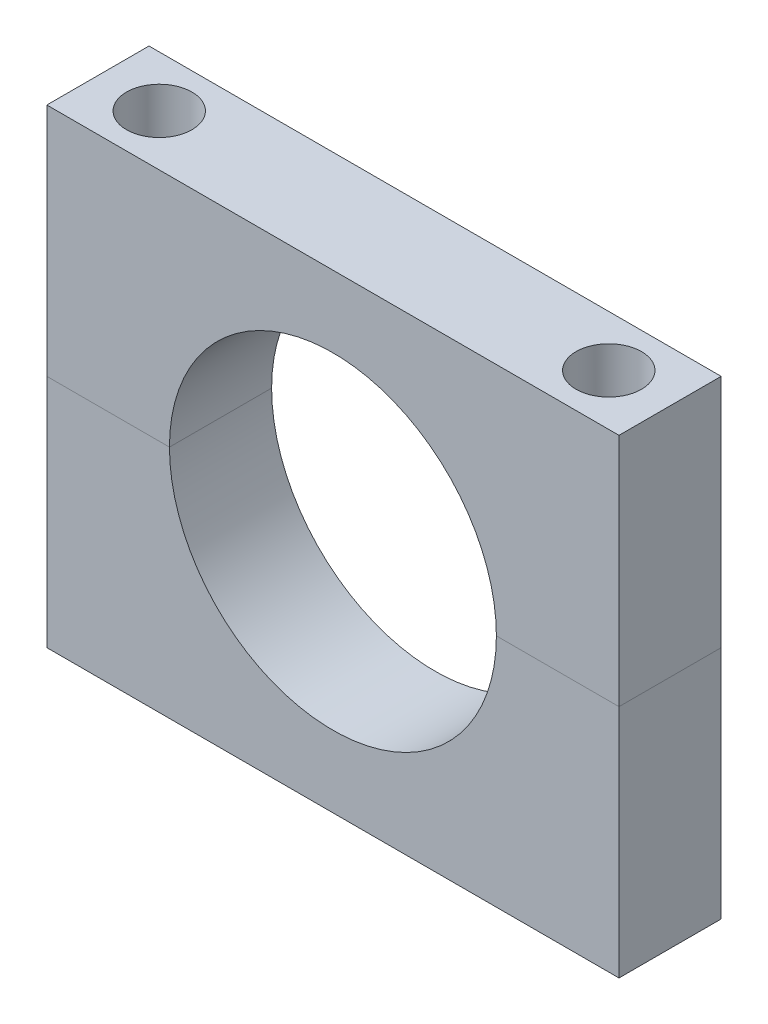
ISO-10303-21;
HEADER;
FILE_DESCRIPTION(('STEP AP214'),'2;1');
FILE_NAME('part.step','',(''),(''),'','','');
FILE_SCHEMA(('AUTOMOTIVE_DESIGN { 1 0 10303 214 1 1 1 1 }'));
ENDSEC;
DATA;
#1=APPLICATION_CONTEXT('core data for automotive mechanical design processes');
#2=APPLICATION_PROTOCOL_DEFINITION('international standard','automotive_design',2000,#1);
#3=PRODUCT_CONTEXT('',#1,'mechanical');
#4=PRODUCT('Part','Part','',(#3));
#5=PRODUCT_RELATED_PRODUCT_CATEGORY('part','',(#4));
#6=PRODUCT_DEFINITION_FORMATION('','',#4);
#7=PRODUCT_DEFINITION_CONTEXT('part definition',#1,'design');
#8=PRODUCT_DEFINITION('design','',#6,#7);
#9=PRODUCT_DEFINITION_SHAPE('','',#8);
#10=(LENGTH_UNIT() NAMED_UNIT(*) SI_UNIT(.MILLI.,.METRE.));
#11=(NAMED_UNIT(*) PLANE_ANGLE_UNIT() SI_UNIT($,.RADIAN.));
#12=(NAMED_UNIT(*) SI_UNIT($,.STERADIAN.) SOLID_ANGLE_UNIT());
#13=UNCERTAINTY_MEASURE_WITH_UNIT(LENGTH_MEASURE(1.E-05),#10,'distance_accuracy_value','');
#14=(GEOMETRIC_REPRESENTATION_CONTEXT(3) GLOBAL_UNCERTAINTY_ASSIGNED_CONTEXT((#13)) GLOBAL_UNIT_ASSIGNED_CONTEXT((#10,
#11,#12)) REPRESENTATION_CONTEXT('',''));
#15=CARTESIAN_POINT('',(0.,0.,0.));
#16=DIRECTION('',(0.,0.,1.));
#17=DIRECTION('',(1.,0.,0.));
#18=AXIS2_PLACEMENT_3D('',#15,#16,#17);
#19=CARTESIAN_POINT('',(0.,0.,0.));
#20=DIRECTION('',(0.,1.,0.));
#21=DIRECTION('',(0.,0.,1.));
#22=AXIS2_PLACEMENT_3D('',#19,#20,#21);
#23=PLANE('',#22);
#24=DIRECTION('',(1.,0.,0.));
#25=VECTOR('',#24,1.);
#26=CARTESIAN_POINT('',(0.,0.,5.));
#27=LINE('',#26,#25);
#28=CARTESIAN_POINT('',(7.99999999999999,0.,5.));
#29=VERTEX_POINT('',#28);
#30=CARTESIAN_POINT('',(14.,0.,5.));
#31=VERTEX_POINT('',#30);
#32=EDGE_CURVE('E150',#29,#31,#27,.T.);
#33=ORIENTED_EDGE('',*,*,#32,.T.);
#34=DIRECTION('',(0.,0.,-1.));
#35=VECTOR('',#34,1.);
#36=CARTESIAN_POINT('',(14.,0.,5.));
#37=LINE('',#36,#35);
#38=CARTESIAN_POINT('',(14.,0.,0.));
#39=VERTEX_POINT('',#38);
#40=EDGE_CURVE('E144',#31,#39,#37,.T.);
#41=ORIENTED_EDGE('',*,*,#40,.T.);
#42=DIRECTION('',(1.,0.,0.));
#43=VECTOR('',#42,1.);
#44=CARTESIAN_POINT('',(0.,0.,0.));
#45=LINE('',#44,#43);
#46=CARTESIAN_POINT('',(7.99999999999999,0.,0.));
#47=VERTEX_POINT('',#46);
#48=EDGE_CURVE('E137',#47,#39,#45,.T.);
#49=ORIENTED_EDGE('',*,*,#48,.F.);
#50=DIRECTION('',(0.,0.,-1.));
#51=VECTOR('',#50,1.);
#52=CARTESIAN_POINT('',(7.99999999999999,0.,5.));
#53=LINE('',#52,#51);
#54=EDGE_CURVE('E97',#29,#47,#53,.T.);
#55=ORIENTED_EDGE('',*,*,#54,.F.);
#56=EDGE_LOOP('',(#33,#41,#49,#55));
#57=FACE_BOUND('',#56,.T.);
#58=CARTESIAN_POINT('',(11.,0.,2.5));
#59=DIRECTION('',(0.,1.,0.));
#60=DIRECTION('',(0.,0.,1.));
#61=AXIS2_PLACEMENT_3D('',#58,#59,#60);
#62=CIRCLE('',#61,1.6);
#63=CARTESIAN_POINT('',(11.,0.,4.1));
#64=VERTEX_POINT('',#63);
#65=EDGE_CURVE('E145',#64,#64,#62,.F.);
#66=ORIENTED_EDGE('',*,*,#65,.T.);
#67=EDGE_LOOP('',(#66));
#68=FACE_BOUND('',#67,.T.);
#69=ADVANCED_FACE('F57',(#57,#68),#23,.T.);
#70=CARTESIAN_POINT('',(-14.,0.,0.));
#71=VERTEX_POINT('',#70);
#72=CARTESIAN_POINT('',(-8.00000000000001,0.,0.));
#73=VERTEX_POINT('',#72);
#74=EDGE_CURVE('E122',#71,#73,#45,.T.);
#75=ORIENTED_EDGE('',*,*,#74,.F.);
#76=DIRECTION('',(0.,0.,1.));
#77=VECTOR('',#76,1.);
#78=CARTESIAN_POINT('',(-14.,0.,5.));
#79=LINE('',#78,#77);
#80=CARTESIAN_POINT('',(-14.,0.,5.));
#81=VERTEX_POINT('',#80);
#82=EDGE_CURVE('E134',#71,#81,#79,.T.);
#83=ORIENTED_EDGE('',*,*,#82,.T.);
#84=CARTESIAN_POINT('',(-8.00000000000001,0.,5.));
#85=VERTEX_POINT('',#84);
#86=EDGE_CURVE('E138',#81,#85,#27,.T.);
#87=ORIENTED_EDGE('',*,*,#86,.T.);
#88=DIRECTION('',(0.,0.,-1.));
#89=VECTOR('',#88,1.);
#90=CARTESIAN_POINT('',(-8.00000000000001,0.,5.));
#91=LINE('',#90,#89);
#92=EDGE_CURVE('E135',#73,#85,#91,.F.);
#93=ORIENTED_EDGE('',*,*,#92,.F.);
#94=EDGE_LOOP('',(#75,#83,#87,#93));
#95=FACE_BOUND('',#94,.T.);
#96=CARTESIAN_POINT('',(-11.,0.,2.5));
#97=DIRECTION('',(0.,1.,0.));
#98=DIRECTION('',(0.,0.,1.));
#99=AXIS2_PLACEMENT_3D('',#96,#97,#98);
#100=CIRCLE('',#99,1.6);
#101=CARTESIAN_POINT('',(-11.,0.,4.1));
#102=VERTEX_POINT('',#101);
#103=EDGE_CURVE('E153',#102,#102,#100,.F.);
#104=ORIENTED_EDGE('',*,*,#103,.T.);
#105=EDGE_LOOP('',(#104));
#106=FACE_BOUND('',#105,.T.);
#107=ADVANCED_FACE('F131',(#95,#106),#23,.T.);
#108=CARTESIAN_POINT('',(0.,0.,5.));
#109=DIRECTION('',(0.,0.,-1.));
#110=DIRECTION('',(-1.,0.,0.));
#111=AXIS2_PLACEMENT_3D('',#108,#109,#110);
#112=PLANE('',#111);
#113=ORIENTED_EDGE('',*,*,#86,.F.);
#114=DIRECTION('',(0.,-1.,0.));
#115=VECTOR('',#114,1.);
#116=CARTESIAN_POINT('',(-14.,-11.5,5.));
#117=LINE('',#116,#115);
#118=CARTESIAN_POINT('',(-14.,-11.5,5.));
#119=VERTEX_POINT('',#118);
#120=EDGE_CURVE('E141',#81,#119,#117,.T.);
#121=ORIENTED_EDGE('',*,*,#120,.T.);
#122=DIRECTION('',(1.,0.,0.));
#123=VECTOR('',#122,1.);
#124=CARTESIAN_POINT('',(-14.,-11.5,5.));
#125=LINE('',#124,#123);
#126=CARTESIAN_POINT('',(14.,-11.5,5.));
#127=VERTEX_POINT('',#126);
#128=EDGE_CURVE('E89',#119,#127,#125,.T.);
#129=ORIENTED_EDGE('',*,*,#128,.T.);
#130=DIRECTION('',(0.,1.,0.));
#131=VECTOR('',#130,1.);
#132=CARTESIAN_POINT('',(14.,-11.5,5.));
#133=LINE('',#132,#131);
#134=EDGE_CURVE('E162',#127,#31,#133,.T.);
#135=ORIENTED_EDGE('',*,*,#134,.T.);
#136=ORIENTED_EDGE('',*,*,#32,.F.);
#137=CARTESIAN_POINT('',(0.,0.,5.));
#138=DIRECTION('',(0.,0.,1.));
#139=DIRECTION('',(1.,0.,0.));
#140=AXIS2_PLACEMENT_3D('',#137,#138,#139);
#141=CIRCLE('',#140,8.);
#142=EDGE_CURVE('E166',#85,#29,#141,.T.);
#143=ORIENTED_EDGE('',*,*,#142,.F.);
#144=EDGE_LOOP('',(#113,#121,#129,#135,#136,#143));
#145=FACE_BOUND('',#144,.T.);
#146=ADVANCED_FACE('F187',(#145),#112,.F.);
#147=CARTESIAN_POINT('',(0.,0.,0.));
#148=DIRECTION('',(0.,0.,-1.));
#149=DIRECTION('',(-1.,0.,0.));
#150=AXIS2_PLACEMENT_3D('',#147,#148,#149);
#151=PLANE('',#150);
#152=DIRECTION('',(0.,-1.,0.));
#153=VECTOR('',#152,1.);
#154=CARTESIAN_POINT('',(-14.,-11.5,0.));
#155=LINE('',#154,#153);
#156=CARTESIAN_POINT('',(-14.,-11.5,0.));
#157=VERTEX_POINT('',#156);
#158=EDGE_CURVE('E77',#71,#157,#155,.T.);
#159=ORIENTED_EDGE('',*,*,#158,.F.);
#160=ORIENTED_EDGE('',*,*,#74,.T.);
#161=CARTESIAN_POINT('',(0.,0.,0.));
#162=DIRECTION('',(0.,0.,1.));
#163=DIRECTION('',(1.,0.,0.));
#164=AXIS2_PLACEMENT_3D('',#161,#162,#163);
#165=CIRCLE('',#164,8.);
#166=EDGE_CURVE('E61',#73,#47,#165,.T.);
#167=ORIENTED_EDGE('',*,*,#166,.T.);
#168=ORIENTED_EDGE('',*,*,#48,.T.);
#169=DIRECTION('',(0.,1.,0.));
#170=VECTOR('',#169,1.);
#171=CARTESIAN_POINT('',(14.,-11.5,0.));
#172=LINE('',#171,#170);
#173=CARTESIAN_POINT('',(14.,-11.5,0.));
#174=VERTEX_POINT('',#173);
#175=EDGE_CURVE('E127',#174,#39,#172,.T.);
#176=ORIENTED_EDGE('',*,*,#175,.F.);
#177=DIRECTION('',(1.,0.,0.));
#178=VECTOR('',#177,1.);
#179=CARTESIAN_POINT('',(-14.,-11.5,0.));
#180=LINE('',#179,#178);
#181=EDGE_CURVE('E125',#157,#174,#180,.T.);
#182=ORIENTED_EDGE('',*,*,#181,.F.);
#183=EDGE_LOOP('',(#159,#160,#167,#168,#176,#182));
#184=FACE_BOUND('',#183,.T.);
#185=ADVANCED_FACE('F120',(#184),#151,.T.);
#186=CARTESIAN_POINT('',(14.,-11.5,5.));
#187=DIRECTION('',(-1.,0.,0.));
#188=DIRECTION('',(0.,0.,1.));
#189=AXIS2_PLACEMENT_3D('',#186,#187,#188);
#190=PLANE('',#189);
#191=ORIENTED_EDGE('',*,*,#40,.F.);
#192=ORIENTED_EDGE('',*,*,#134,.F.);
#193=DIRECTION('',(0.,0.,-1.));
#194=VECTOR('',#193,1.);
#195=CARTESIAN_POINT('',(14.,-11.5,5.));
#196=LINE('',#195,#194);
#197=EDGE_CURVE('E191',#127,#174,#196,.T.);
#198=ORIENTED_EDGE('',*,*,#197,.T.);
#199=ORIENTED_EDGE('',*,*,#175,.T.);
#200=EDGE_LOOP('',(#191,#192,#198,#199));
#201=FACE_BOUND('',#200,.T.);
#202=ADVANCED_FACE('F59',(#201),#190,.F.);
#203=CARTESIAN_POINT('',(-14.,-11.5,5.));
#204=DIRECTION('',(1.,0.,0.));
#205=DIRECTION('',(0.,0.,-1.));
#206=AXIS2_PLACEMENT_3D('',#203,#204,#205);
#207=PLANE('',#206);
#208=ORIENTED_EDGE('',*,*,#82,.F.);
#209=ORIENTED_EDGE('',*,*,#158,.T.);
#210=DIRECTION('',(0.,0.,-1.));
#211=VECTOR('',#210,1.);
#212=CARTESIAN_POINT('',(-14.,-11.5,5.));
#213=LINE('',#212,#211);
#214=EDGE_CURVE('E182',#119,#157,#213,.T.);
#215=ORIENTED_EDGE('',*,*,#214,.F.);
#216=ORIENTED_EDGE('',*,*,#120,.F.);
#217=EDGE_LOOP('',(#208,#209,#215,#216));
#218=FACE_BOUND('',#217,.T.);
#219=ADVANCED_FACE('F140',(#218),#207,.F.);
#220=CARTESIAN_POINT('',(0.,0.,5.));
#221=DIRECTION('',(0.,0.,-1.));
#222=DIRECTION('',(-1.,0.,0.));
#223=AXIS2_PLACEMENT_3D('',#220,#221,#222);
#224=CYLINDRICAL_SURFACE('',#223,8.);
#225=ORIENTED_EDGE('',*,*,#142,.T.);
#226=ORIENTED_EDGE('',*,*,#54,.T.);
#227=ORIENTED_EDGE('',*,*,#166,.F.);
#228=ORIENTED_EDGE('',*,*,#92,.T.);
#229=EDGE_LOOP('',(#225,#226,#227,#228));
#230=FACE_BOUND('',#229,.T.);
#231=ADVANCED_FACE('F223',(#230),#224,.F.);
#232=CARTESIAN_POINT('',(11.,-11.5,2.5));
#233=DIRECTION('',(0.,1.,0.));
#234=DIRECTION('',(0.,0.,1.));
#235=AXIS2_PLACEMENT_3D('',#232,#233,#234);
#236=CYLINDRICAL_SURFACE('',#235,1.6);
#237=CARTESIAN_POINT('',(11.,-11.5,2.5));
#238=DIRECTION('',(0.,1.,0.));
#239=DIRECTION('',(0.,0.,-1.));
#240=AXIS2_PLACEMENT_3D('',#237,#238,#239);
#241=CIRCLE('',#240,1.6);
#242=CARTESIAN_POINT('',(11.,-11.5,0.899999999999998));
#243=VERTEX_POINT('',#242);
#244=EDGE_CURVE('E12',#243,#243,#241,.T.);
#245=ORIENTED_EDGE('',*,*,#244,.F.);
#246=EDGE_LOOP('',(#245));
#247=FACE_BOUND('',#246,.T.);
#248=ORIENTED_EDGE('',*,*,#65,.F.);
#249=EDGE_LOOP('',(#248));
#250=FACE_BOUND('',#249,.T.);
#251=ADVANCED_FACE('F209',(#247,#250),#236,.F.);
#252=CARTESIAN_POINT('',(-11.,-11.5,2.5));
#253=DIRECTION('',(0.,1.,0.));
#254=DIRECTION('',(0.,0.,1.));
#255=AXIS2_PLACEMENT_3D('',#252,#253,#254);
#256=CYLINDRICAL_SURFACE('',#255,1.6);
#257=CARTESIAN_POINT('',(-11.,-11.5,2.5));
#258=DIRECTION('',(0.,1.,0.));
#259=DIRECTION('',(0.,0.,1.));
#260=AXIS2_PLACEMENT_3D('',#257,#258,#259);
#261=CIRCLE('',#260,1.6);
#262=CARTESIAN_POINT('',(-11.,-11.5,4.1));
#263=VERTEX_POINT('',#262);
#264=EDGE_CURVE('E68',#263,#263,#261,.T.);
#265=ORIENTED_EDGE('',*,*,#264,.F.);
#266=EDGE_LOOP('',(#265));
#267=FACE_BOUND('',#266,.T.);
#268=ORIENTED_EDGE('',*,*,#103,.F.);
#269=EDGE_LOOP('',(#268));
#270=FACE_BOUND('',#269,.T.);
#271=ADVANCED_FACE('F204',(#267,#270),#256,.F.);
#272=CARTESIAN_POINT('',(-14.,-11.5,5.));
#273=DIRECTION('',(0.,1.,0.));
#274=DIRECTION('',(0.,0.,1.));
#275=AXIS2_PLACEMENT_3D('',#272,#273,#274);
#276=PLANE('',#275);
#277=ORIENTED_EDGE('',*,*,#264,.T.);
#278=EDGE_LOOP('',(#277));
#279=FACE_BOUND('',#278,.T.);
#280=ORIENTED_EDGE('',*,*,#244,.T.);
#281=EDGE_LOOP('',(#280));
#282=FACE_BOUND('',#281,.T.);
#283=ORIENTED_EDGE('',*,*,#181,.T.);
#284=ORIENTED_EDGE('',*,*,#197,.F.);
#285=ORIENTED_EDGE('',*,*,#128,.F.);
#286=ORIENTED_EDGE('',*,*,#214,.T.);
#287=EDGE_LOOP('',(#283,#284,#285,#286));
#288=FACE_BOUND('',#287,.T.);
#289=ADVANCED_FACE('F202',(#279,#282,#288),#276,.F.);
#290=CLOSED_SHELL('',(#69,#107,#146,#185,#202,#219,#231,#251,#271,#289));
#291=MANIFOLD_SOLID_BREP('B2',#290);
#292=CARTESIAN_POINT('',(0.,0.,0.));
#293=DIRECTION('',(0.,1.,0.));
#294=DIRECTION('',(0.,0.,1.));
#295=AXIS2_PLACEMENT_3D('',#292,#293,#294);
#296=PLANE('',#295);
#297=CARTESIAN_POINT('',(11.,0.,2.5));
#298=DIRECTION('',(0.,1.,0.));
#299=DIRECTION('',(0.,0.,1.));
#300=AXIS2_PLACEMENT_3D('',#297,#298,#299);
#301=CIRCLE('',#300,1.6);
#302=CARTESIAN_POINT('',(11.,0.,4.1));
#303=VERTEX_POINT('',#302);
#304=EDGE_CURVE('E371',#303,#303,#301,.F.);
#305=ORIENTED_EDGE('',*,*,#304,.F.);
#306=EDGE_LOOP('',(#305));
#307=FACE_BOUND('',#306,.T.);
#308=DIRECTION('',(1.,0.,0.));
#309=VECTOR('',#308,1.);
#310=CARTESIAN_POINT('',(0.,0.,5.));
#311=LINE('',#310,#309);
#312=CARTESIAN_POINT('',(7.99999999999999,0.,5.));
#313=VERTEX_POINT('',#312);
#314=CARTESIAN_POINT('',(14.,0.,5.));
#315=VERTEX_POINT('',#314);
#316=EDGE_CURVE('E350',#313,#315,#311,.T.);
#317=ORIENTED_EDGE('',*,*,#316,.F.);
#318=DIRECTION('',(0.,0.,-1.));
#319=VECTOR('',#318,1.);
#320=CARTESIAN_POINT('',(7.99999999999999,0.,5.));
#321=LINE('',#320,#319);
#322=CARTESIAN_POINT('',(7.99999999999999,0.,0.));
#323=VERTEX_POINT('',#322);
#324=EDGE_CURVE('E298',#313,#323,#321,.T.);
#325=ORIENTED_EDGE('',*,*,#324,.T.);
#326=DIRECTION('',(1.,0.,0.));
#327=VECTOR('',#326,1.);
#328=CARTESIAN_POINT('',(0.,0.,0.));
#329=LINE('',#328,#327);
#330=CARTESIAN_POINT('',(14.,0.,0.));
#331=VERTEX_POINT('',#330);
#332=EDGE_CURVE('E379',#323,#331,#329,.T.);
#333=ORIENTED_EDGE('',*,*,#332,.T.);
#334=DIRECTION('',(0.,0.,-1.));
#335=VECTOR('',#334,1.);
#336=CARTESIAN_POINT('',(14.,0.,5.));
#337=LINE('',#336,#335);
#338=EDGE_CURVE('E293',#315,#331,#337,.T.);
#339=ORIENTED_EDGE('',*,*,#338,.F.);
#340=EDGE_LOOP('',(#317,#325,#333,#339));
#341=FACE_BOUND('',#340,.T.);
#342=ADVANCED_FACE('F290',(#307,#341),#296,.F.);
#343=CARTESIAN_POINT('',(-11.,0.,2.5));
#344=DIRECTION('',(0.,1.,0.));
#345=DIRECTION('',(0.,0.,1.));
#346=AXIS2_PLACEMENT_3D('',#343,#344,#345);
#347=CIRCLE('',#346,1.6);
#348=CARTESIAN_POINT('',(-11.,0.,4.1));
#349=VERTEX_POINT('',#348);
#350=EDGE_CURVE('E368',#349,#349,#347,.F.);
#351=ORIENTED_EDGE('',*,*,#350,.F.);
#352=EDGE_LOOP('',(#351));
#353=FACE_BOUND('',#352,.T.);
#354=CARTESIAN_POINT('',(-14.,0.,0.));
#355=VERTEX_POINT('',#354);
#356=CARTESIAN_POINT('',(-8.00000000000001,0.,0.));
#357=VERTEX_POINT('',#356);
#358=EDGE_CURVE('E382',#355,#357,#329,.T.);
#359=ORIENTED_EDGE('',*,*,#358,.T.);
#360=DIRECTION('',(0.,0.,-1.));
#361=VECTOR('',#360,1.);
#362=CARTESIAN_POINT('',(-8.00000000000001,0.,5.));
#363=LINE('',#362,#361);
#364=CARTESIAN_POINT('',(-8.00000000000001,0.,5.));
#365=VERTEX_POINT('',#364);
#366=EDGE_CURVE('E55',#357,#365,#363,.F.);
#367=ORIENTED_EDGE('',*,*,#366,.T.);
#368=CARTESIAN_POINT('',(-14.,0.,5.));
#369=VERTEX_POINT('',#368);
#370=EDGE_CURVE('E313',#369,#365,#311,.T.);
#371=ORIENTED_EDGE('',*,*,#370,.F.);
#372=DIRECTION('',(0.,0.,1.));
#373=VECTOR('',#372,1.);
#374=CARTESIAN_POINT('',(-14.,0.,5.));
#375=LINE('',#374,#373);
#376=EDGE_CURVE('E377',#355,#369,#375,.T.);
#377=ORIENTED_EDGE('',*,*,#376,.F.);
#378=EDGE_LOOP('',(#359,#367,#371,#377));
#379=FACE_BOUND('',#378,.T.);
#380=ADVANCED_FACE('F409',(#353,#379),#296,.F.);
#381=CARTESIAN_POINT('',(-14.,11.5,5.));
#382=DIRECTION('',(0.,-1.,0.));
#383=DIRECTION('',(0.,0.,-1.));
#384=AXIS2_PLACEMENT_3D('',#381,#382,#383);
#385=PLANE('',#384);
#386=CARTESIAN_POINT('',(-11.,11.5,2.5));
#387=DIRECTION('',(0.,1.,0.));
#388=DIRECTION('',(0.,0.,1.));
#389=AXIS2_PLACEMENT_3D('',#386,#387,#388);
#390=CIRCLE('',#389,1.6);
#391=CARTESIAN_POINT('',(-11.,11.5,4.1));
#392=VERTEX_POINT('',#391);
#393=EDGE_CURVE('E392',#392,#392,#390,.T.);
#394=ORIENTED_EDGE('',*,*,#393,.F.);
#395=EDGE_LOOP('',(#394));
#396=FACE_BOUND('',#395,.T.);
#397=CARTESIAN_POINT('',(11.,11.5,2.5));
#398=DIRECTION('',(0.,1.,0.));
#399=DIRECTION('',(0.,0.,-1.));
#400=AXIS2_PLACEMENT_3D('',#397,#398,#399);
#401=CIRCLE('',#400,1.6);
#402=CARTESIAN_POINT('',(11.,11.5,0.899999999999998));
#403=VERTEX_POINT('',#402);
#404=EDGE_CURVE('E396',#403,#403,#401,.T.);
#405=ORIENTED_EDGE('',*,*,#404,.F.);
#406=EDGE_LOOP('',(#405));
#407=FACE_BOUND('',#406,.T.);
#408=DIRECTION('',(-1.,0.,0.));
#409=VECTOR('',#408,1.);
#410=CARTESIAN_POINT('',(-14.,11.5,0.));
#411=LINE('',#410,#409);
#412=CARTESIAN_POINT('',(14.,11.5,0.));
#413=VERTEX_POINT('',#412);
#414=CARTESIAN_POINT('',(-14.,11.5,0.));
#415=VERTEX_POINT('',#414);
#416=EDGE_CURVE('E402',#413,#415,#411,.T.);
#417=ORIENTED_EDGE('',*,*,#416,.T.);
#418=DIRECTION('',(0.,0.,-1.));
#419=VECTOR('',#418,1.);
#420=CARTESIAN_POINT('',(-14.,11.5,5.));
#421=LINE('',#420,#419);
#422=CARTESIAN_POINT('',(-14.,11.5,5.));
#423=VERTEX_POINT('',#422);
#424=EDGE_CURVE('E360',#423,#415,#421,.T.);
#425=ORIENTED_EDGE('',*,*,#424,.F.);
#426=DIRECTION('',(-1.,0.,0.));
#427=VECTOR('',#426,1.);
#428=CARTESIAN_POINT('',(-14.,11.5,5.));
#429=LINE('',#428,#427);
#430=CARTESIAN_POINT('',(14.,11.5,5.));
#431=VERTEX_POINT('',#430);
#432=EDGE_CURVE('E348',#431,#423,#429,.T.);
#433=ORIENTED_EDGE('',*,*,#432,.F.);
#434=DIRECTION('',(0.,0.,-1.));
#435=VECTOR('',#434,1.);
#436=CARTESIAN_POINT('',(14.,11.5,5.));
#437=LINE('',#436,#435);
#438=EDGE_CURVE('E358',#431,#413,#437,.T.);
#439=ORIENTED_EDGE('',*,*,#438,.T.);
#440=EDGE_LOOP('',(#417,#425,#433,#439));
#441=FACE_BOUND('',#440,.T.);
#442=ADVANCED_FACE('F357',(#396,#407,#441),#385,.F.);
#443=CARTESIAN_POINT('',(-11.,-11.5,2.5));
#444=DIRECTION('',(0.,1.,0.));
#445=DIRECTION('',(0.,0.,1.));
#446=AXIS2_PLACEMENT_3D('',#443,#444,#445);
#447=CYLINDRICAL_SURFACE('',#446,1.6);
#448=ORIENTED_EDGE('',*,*,#350,.T.);
#449=EDGE_LOOP('',(#448));
#450=FACE_BOUND('',#449,.T.);
#451=ORIENTED_EDGE('',*,*,#393,.T.);
#452=EDGE_LOOP('',(#451));
#453=FACE_BOUND('',#452,.T.);
#454=ADVANCED_FACE('F417',(#450,#453),#447,.F.);
#455=CARTESIAN_POINT('',(11.,-11.5,2.5));
#456=DIRECTION('',(0.,1.,0.));
#457=DIRECTION('',(0.,0.,1.));
#458=AXIS2_PLACEMENT_3D('',#455,#456,#457);
#459=CYLINDRICAL_SURFACE('',#458,1.6);
#460=ORIENTED_EDGE('',*,*,#304,.T.);
#461=EDGE_LOOP('',(#460));
#462=FACE_BOUND('',#461,.T.);
#463=ORIENTED_EDGE('',*,*,#404,.T.);
#464=EDGE_LOOP('',(#463));
#465=FACE_BOUND('',#464,.T.);
#466=ADVANCED_FACE('F430',(#462,#465),#459,.F.);
#467=CARTESIAN_POINT('',(0.,0.,0.));
#468=DIRECTION('',(0.,0.,-1.));
#469=DIRECTION('',(-1.,0.,0.));
#470=AXIS2_PLACEMENT_3D('',#467,#468,#469);
#471=PLANE('',#470);
#472=ORIENTED_EDGE('',*,*,#358,.F.);
#473=DIRECTION('',(0.,-1.,0.));
#474=VECTOR('',#473,1.);
#475=CARTESIAN_POINT('',(-14.,-11.5,0.));
#476=LINE('',#475,#474);
#477=EDGE_CURVE('E353',#415,#355,#476,.T.);
#478=ORIENTED_EDGE('',*,*,#477,.F.);
#479=ORIENTED_EDGE('',*,*,#416,.F.);
#480=DIRECTION('',(0.,1.,0.));
#481=VECTOR('',#480,1.);
#482=CARTESIAN_POINT('',(14.,-11.5,0.));
#483=LINE('',#482,#481);
#484=EDGE_CURVE('E366',#331,#413,#483,.T.);
#485=ORIENTED_EDGE('',*,*,#484,.F.);
#486=ORIENTED_EDGE('',*,*,#332,.F.);
#487=CARTESIAN_POINT('',(0.,0.,0.));
#488=DIRECTION('',(0.,0.,1.));
#489=DIRECTION('',(1.,0.,0.));
#490=AXIS2_PLACEMENT_3D('',#487,#488,#489);
#491=CIRCLE('',#490,8.);
#492=EDGE_CURVE('E386',#323,#357,#491,.T.);
#493=ORIENTED_EDGE('',*,*,#492,.T.);
#494=EDGE_LOOP('',(#472,#478,#479,#485,#486,#493));
#495=FACE_BOUND('',#494,.T.);
#496=ADVANCED_FACE('F407',(#495),#471,.T.);
#497=CARTESIAN_POINT('',(0.,0.,5.));
#498=DIRECTION('',(0.,0.,-1.));
#499=DIRECTION('',(-1.,0.,0.));
#500=AXIS2_PLACEMENT_3D('',#497,#498,#499);
#501=PLANE('',#500);
#502=DIRECTION('',(0.,-1.,0.));
#503=VECTOR('',#502,1.);
#504=CARTESIAN_POINT('',(-14.,-11.5,5.));
#505=LINE('',#504,#503);
#506=EDGE_CURVE('E362',#423,#369,#505,.T.);
#507=ORIENTED_EDGE('',*,*,#506,.T.);
#508=ORIENTED_EDGE('',*,*,#370,.T.);
#509=CARTESIAN_POINT('',(0.,0.,5.));
#510=DIRECTION('',(0.,0.,1.));
#511=DIRECTION('',(1.,0.,0.));
#512=AXIS2_PLACEMENT_3D('',#509,#510,#511);
#513=CIRCLE('',#512,8.);
#514=EDGE_CURVE('E391',#313,#365,#513,.T.);
#515=ORIENTED_EDGE('',*,*,#514,.F.);
#516=ORIENTED_EDGE('',*,*,#316,.T.);
#517=DIRECTION('',(0.,1.,0.));
#518=VECTOR('',#517,1.);
#519=CARTESIAN_POINT('',(14.,-11.5,5.));
#520=LINE('',#519,#518);
#521=EDGE_CURVE('E345',#315,#431,#520,.T.);
#522=ORIENTED_EDGE('',*,*,#521,.T.);
#523=ORIENTED_EDGE('',*,*,#432,.T.);
#524=EDGE_LOOP('',(#507,#508,#515,#516,#522,#523));
#525=FACE_BOUND('',#524,.T.);
#526=ADVANCED_FACE('F347',(#525),#501,.F.);
#527=CARTESIAN_POINT('',(0.,0.,5.));
#528=DIRECTION('',(0.,0.,-1.));
#529=DIRECTION('',(-1.,0.,0.));
#530=AXIS2_PLACEMENT_3D('',#527,#528,#529);
#531=CYLINDRICAL_SURFACE('',#530,8.);
#532=ORIENTED_EDGE('',*,*,#324,.F.);
#533=ORIENTED_EDGE('',*,*,#514,.T.);
#534=ORIENTED_EDGE('',*,*,#366,.F.);
#535=ORIENTED_EDGE('',*,*,#492,.F.);
#536=EDGE_LOOP('',(#532,#533,#534,#535));
#537=FACE_BOUND('',#536,.T.);
#538=ADVANCED_FACE('F387',(#537),#531,.F.);
#539=CARTESIAN_POINT('',(-14.,-11.5,5.));
#540=DIRECTION('',(1.,0.,0.));
#541=DIRECTION('',(0.,0.,-1.));
#542=AXIS2_PLACEMENT_3D('',#539,#540,#541);
#543=PLANE('',#542);
#544=ORIENTED_EDGE('',*,*,#477,.T.);
#545=ORIENTED_EDGE('',*,*,#376,.T.);
#546=ORIENTED_EDGE('',*,*,#506,.F.);
#547=ORIENTED_EDGE('',*,*,#424,.T.);
#548=EDGE_LOOP('',(#544,#545,#546,#547));
#549=FACE_BOUND('',#548,.T.);
#550=ADVANCED_FACE('F406',(#549),#543,.F.);
#551=CARTESIAN_POINT('',(14.,-11.5,5.));
#552=DIRECTION('',(-1.,0.,0.));
#553=DIRECTION('',(0.,0.,1.));
#554=AXIS2_PLACEMENT_3D('',#551,#552,#553);
#555=PLANE('',#554);
#556=ORIENTED_EDGE('',*,*,#521,.F.);
#557=ORIENTED_EDGE('',*,*,#338,.T.);
#558=ORIENTED_EDGE('',*,*,#484,.T.);
#559=ORIENTED_EDGE('',*,*,#438,.F.);
#560=EDGE_LOOP('',(#556,#557,#558,#559));
#561=FACE_BOUND('',#560,.T.);
#562=ADVANCED_FACE('F364',(#561),#555,.F.);
#563=CLOSED_SHELL('',(#342,#380,#442,#454,#466,#496,#526,#538,#550,#562));
#564=MANIFOLD_SOLID_BREP('B6',#563);
#565=ADVANCED_BREP_SHAPE_REPRESENTATION('',(#18,#291,#564),#14);
#566=SHAPE_DEFINITION_REPRESENTATION(#9,#565);
ENDSEC;
END-ISO-10303-21;
